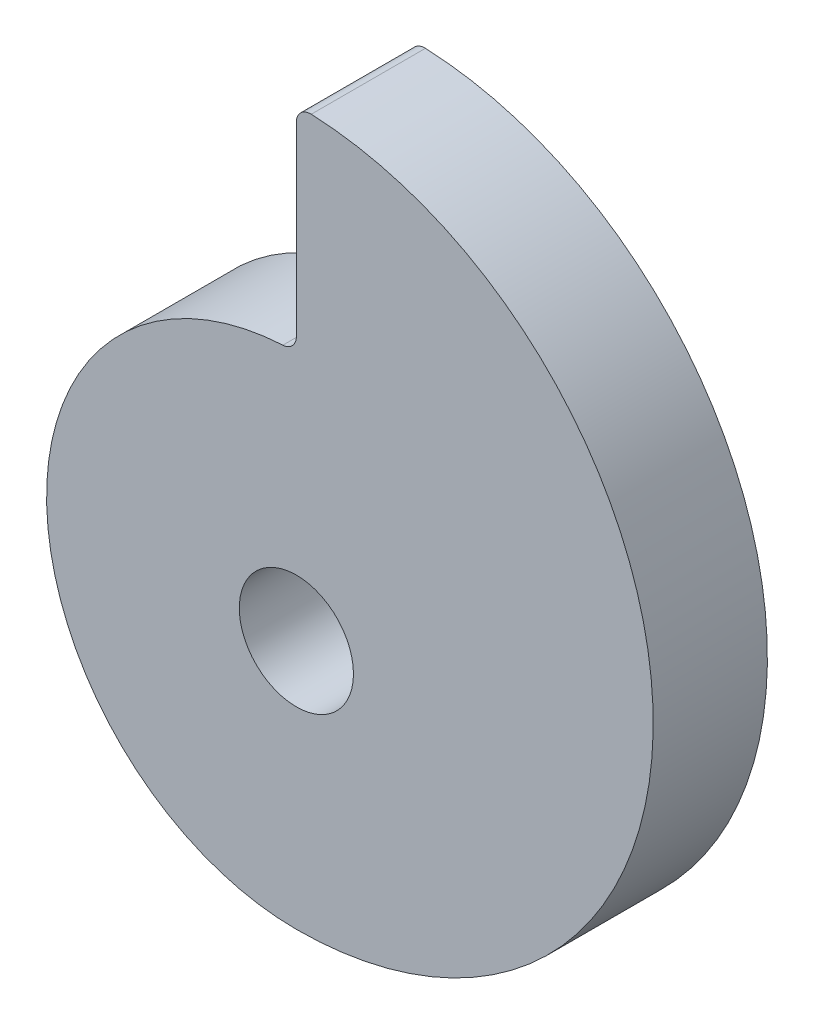
ISO-10303-21;
HEADER;
FILE_DESCRIPTION(('STEP AP214'),'2;1');
FILE_NAME('part.step','',(''),(''),'','','');
FILE_SCHEMA(('AUTOMOTIVE_DESIGN { 1 0 10303 214 1 1 1 1 }'));
ENDSEC;
DATA;
#1=APPLICATION_CONTEXT('core data for automotive mechanical design processes');
#2=APPLICATION_PROTOCOL_DEFINITION('international standard','automotive_design',2000,#1);
#3=PRODUCT_CONTEXT('',#1,'mechanical');
#4=PRODUCT('Part','Part','',(#3));
#5=PRODUCT_RELATED_PRODUCT_CATEGORY('part','',(#4));
#6=PRODUCT_DEFINITION_FORMATION('','',#4);
#7=PRODUCT_DEFINITION_CONTEXT('part definition',#1,'design');
#8=PRODUCT_DEFINITION('design','',#6,#7);
#9=PRODUCT_DEFINITION_SHAPE('','',#8);
#10=(LENGTH_UNIT() NAMED_UNIT(*) SI_UNIT(.MILLI.,.METRE.));
#11=(NAMED_UNIT(*) PLANE_ANGLE_UNIT() SI_UNIT($,.RADIAN.));
#12=(NAMED_UNIT(*) SI_UNIT($,.STERADIAN.) SOLID_ANGLE_UNIT());
#13=UNCERTAINTY_MEASURE_WITH_UNIT(LENGTH_MEASURE(1.E-05),#10,'distance_accuracy_value','');
#14=(GEOMETRIC_REPRESENTATION_CONTEXT(3) GLOBAL_UNCERTAINTY_ASSIGNED_CONTEXT((#13)) GLOBAL_UNIT_ASSIGNED_CONTEXT((#10,
#11,#12)) REPRESENTATION_CONTEXT('',''));
#15=CARTESIAN_POINT('',(0.,0.,0.));
#16=DIRECTION('',(0.,0.,1.));
#17=DIRECTION('',(1.,0.,0.));
#18=AXIS2_PLACEMENT_3D('',#15,#16,#17);
#19=CARTESIAN_POINT('',(0.,-7.5,8.));
#20=DIRECTION('',(0.,0.,1.));
#21=DIRECTION('',(1.,0.,0.));
#22=AXIS2_PLACEMENT_3D('',#19,#20,#21);
#23=PLANE('',#22);
#24=CARTESIAN_POINT('',(0.,0.,8.));
#25=DIRECTION('',(0.,0.,1.));
#26=DIRECTION('',(1.,0.,0.));
#27=AXIS2_PLACEMENT_3D('',#24,#25,#26);
#28=CIRCLE('',#27,25.);
#29=CARTESIAN_POINT('',(0.,-25.,8.));
#30=VERTEX_POINT('',#29);
#31=CARTESIAN_POINT('',(1.04166666666667,24.9782891839204,8.));
#32=VERTEX_POINT('',#31);
#33=EDGE_CURVE('E86',#30,#32,#28,.T.);
#34=ORIENTED_EDGE('',*,*,#33,.T.);
#35=CARTESIAN_POINT('',(1.,23.9791576165636,8.));
#36=DIRECTION('',(0.,0.,1.));
#37=DIRECTION('',(1.,0.,0.));
#38=AXIS2_PLACEMENT_3D('',#35,#36,#37);
#39=CIRCLE('',#38,1.);
#40=CARTESIAN_POINT('',(0.,23.9791576165636,8.));
#41=VERTEX_POINT('',#40);
#42=EDGE_CURVE('E116',#32,#41,#39,.T.);
#43=ORIENTED_EDGE('',*,*,#42,.T.);
#44=DIRECTION('',(0.,-1.,0.));
#45=VECTOR('',#44,1.);
#46=CARTESIAN_POINT('',(0.,10.,8.));
#47=LINE('',#46,#45);
#48=CARTESIAN_POINT('',(0.,10.9729532019112,8.));
#49=VERTEX_POINT('',#48);
#50=EDGE_CURVE('E97',#41,#49,#47,.T.);
#51=ORIENTED_EDGE('',*,*,#50,.T.);
#52=CARTESIAN_POINT('',(-1.,10.9729532019112,8.));
#53=DIRECTION('',(0.,0.,1.));
#54=DIRECTION('',(1.,0.,0.));
#55=AXIS2_PLACEMENT_3D('',#52,#53,#54);
#56=CIRCLE('',#55,1.);
#57=CARTESIAN_POINT('',(-0.945945945945946,9.97441519099705,8.));
#58=VERTEX_POINT('',#57);
#59=EDGE_CURVE('E11',#49,#58,#56,.F.);
#60=ORIENTED_EDGE('',*,*,#59,.T.);
#61=CARTESIAN_POINT('',(0.,-7.5,8.));
#62=DIRECTION('',(0.,0.,1.));
#63=DIRECTION('',(1.,0.,0.));
#64=AXIS2_PLACEMENT_3D('',#61,#62,#63);
#65=CIRCLE('',#64,17.5);
#66=EDGE_CURVE('E84',#58,#30,#65,.T.);
#67=ORIENTED_EDGE('',*,*,#66,.T.);
#68=EDGE_LOOP('',(#34,#43,#51,#60,#67));
#69=FACE_BOUND('',#68,.T.);
#70=CARTESIAN_POINT('',(0.,-7.5,8.));
#71=DIRECTION('',(0.,0.,1.));
#72=DIRECTION('',(1.,0.,0.));
#73=AXIS2_PLACEMENT_3D('',#70,#71,#72);
#74=CIRCLE('',#73,4.);
#75=CARTESIAN_POINT('',(3.99999999999999,-7.5,8.));
#76=VERTEX_POINT('',#75);
#77=EDGE_CURVE('E200',#76,#76,#74,.T.);
#78=ORIENTED_EDGE('',*,*,#77,.F.);
#79=EDGE_LOOP('',(#78));
#80=FACE_BOUND('',#79,.T.);
#81=ADVANCED_FACE('F39',(#69,#80),#23,.T.);
#82=CARTESIAN_POINT('',(0.,-7.5,0.));
#83=DIRECTION('',(0.,0.,1.));
#84=DIRECTION('',(1.,0.,0.));
#85=AXIS2_PLACEMENT_3D('',#82,#83,#84);
#86=PLANE('',#85);
#87=DIRECTION('',(0.,-1.,0.));
#88=VECTOR('',#87,1.);
#89=CARTESIAN_POINT('',(0.,10.,0.));
#90=LINE('',#89,#88);
#91=CARTESIAN_POINT('',(0.,23.9791576165636,0.));
#92=VERTEX_POINT('',#91);
#93=CARTESIAN_POINT('',(0.,10.9729532019112,0.));
#94=VERTEX_POINT('',#93);
#95=EDGE_CURVE('E92',#92,#94,#90,.T.);
#96=ORIENTED_EDGE('',*,*,#95,.F.);
#97=CARTESIAN_POINT('',(1.,23.9791576165636,0.));
#98=DIRECTION('',(0.,0.,1.));
#99=DIRECTION('',(1.,0.,0.));
#100=AXIS2_PLACEMENT_3D('',#97,#98,#99);
#101=CIRCLE('',#100,1.);
#102=CARTESIAN_POINT('',(1.04166666666667,24.9782891839204,0.));
#103=VERTEX_POINT('',#102);
#104=EDGE_CURVE('E113',#92,#103,#101,.F.);
#105=ORIENTED_EDGE('',*,*,#104,.T.);
#106=CARTESIAN_POINT('',(0.,0.,0.));
#107=DIRECTION('',(0.,0.,1.));
#108=DIRECTION('',(1.,0.,0.));
#109=AXIS2_PLACEMENT_3D('',#106,#107,#108);
#110=CIRCLE('',#109,25.);
#111=CARTESIAN_POINT('',(0.,-25.,0.));
#112=VERTEX_POINT('',#111);
#113=EDGE_CURVE('E130',#112,#103,#110,.T.);
#114=ORIENTED_EDGE('',*,*,#113,.F.);
#115=CARTESIAN_POINT('',(0.,-7.5,0.));
#116=DIRECTION('',(0.,0.,1.));
#117=DIRECTION('',(1.,0.,0.));
#118=AXIS2_PLACEMENT_3D('',#115,#116,#117);
#119=CIRCLE('',#118,17.5);
#120=CARTESIAN_POINT('',(-0.945945945945946,9.97441519099705,0.));
#121=VERTEX_POINT('',#120);
#122=EDGE_CURVE('E101',#121,#112,#119,.T.);
#123=ORIENTED_EDGE('',*,*,#122,.F.);
#124=CARTESIAN_POINT('',(-1.,10.9729532019112,0.));
#125=DIRECTION('',(0.,0.,1.));
#126=DIRECTION('',(1.,0.,0.));
#127=AXIS2_PLACEMENT_3D('',#124,#125,#126);
#128=CIRCLE('',#127,1.);
#129=EDGE_CURVE('E47',#121,#94,#128,.T.);
#130=ORIENTED_EDGE('',*,*,#129,.T.);
#131=EDGE_LOOP('',(#96,#105,#114,#123,#130));
#132=FACE_BOUND('',#131,.T.);
#133=CARTESIAN_POINT('',(0.,-7.5,0.));
#134=DIRECTION('',(0.,0.,1.));
#135=DIRECTION('',(1.,0.,0.));
#136=AXIS2_PLACEMENT_3D('',#133,#134,#135);
#137=CIRCLE('',#136,4.);
#138=CARTESIAN_POINT('',(3.99999999999999,-7.5,0.));
#139=VERTEX_POINT('',#138);
#140=EDGE_CURVE('E203',#139,#139,#137,.T.);
#141=ORIENTED_EDGE('',*,*,#140,.T.);
#142=EDGE_LOOP('',(#141));
#143=FACE_BOUND('',#142,.T.);
#144=ADVANCED_FACE('F122',(#132,#143),#86,.F.);
#145=CARTESIAN_POINT('',(0.,-7.5,8.));
#146=DIRECTION('',(0.,0.,-1.));
#147=DIRECTION('',(-1.,0.,0.));
#148=AXIS2_PLACEMENT_3D('',#145,#146,#147);
#149=CYLINDRICAL_SURFACE('',#148,17.5);
#150=ORIENTED_EDGE('',*,*,#66,.F.);
#151=DIRECTION('',(0.,0.,-1.));
#152=VECTOR('',#151,1.);
#153=CARTESIAN_POINT('',(-0.945945945945946,9.97441519099705,8.));
#154=LINE('',#153,#152);
#155=EDGE_CURVE('E118',#58,#121,#154,.T.);
#156=ORIENTED_EDGE('',*,*,#155,.T.);
#157=ORIENTED_EDGE('',*,*,#122,.T.);
#158=DIRECTION('',(0.,0.,-1.));
#159=VECTOR('',#158,1.);
#160=CARTESIAN_POINT('',(0.,-25.,8.));
#161=LINE('',#160,#159);
#162=EDGE_CURVE('E96',#30,#112,#161,.T.);
#163=ORIENTED_EDGE('',*,*,#162,.F.);
#164=EDGE_LOOP('',(#150,#156,#157,#163));
#165=FACE_BOUND('',#164,.T.);
#166=ADVANCED_FACE('F99',(#165),#149,.T.);
#167=CARTESIAN_POINT('',(0.,0.,8.));
#168=DIRECTION('',(0.,0.,-1.));
#169=DIRECTION('',(-1.,0.,0.));
#170=AXIS2_PLACEMENT_3D('',#167,#168,#169);
#171=CYLINDRICAL_SURFACE('',#170,25.);
#172=ORIENTED_EDGE('',*,*,#113,.T.);
#173=DIRECTION('',(0.,0.,-1.));
#174=VECTOR('',#173,1.);
#175=CARTESIAN_POINT('',(1.04166666666667,24.9782891839204,8.));
#176=LINE('',#175,#174);
#177=EDGE_CURVE('E60',#103,#32,#176,.F.);
#178=ORIENTED_EDGE('',*,*,#177,.T.);
#179=ORIENTED_EDGE('',*,*,#33,.F.);
#180=ORIENTED_EDGE('',*,*,#162,.T.);
#181=EDGE_LOOP('',(#172,#178,#179,#180));
#182=FACE_BOUND('',#181,.T.);
#183=ADVANCED_FACE('F95',(#182),#171,.T.);
#184=CARTESIAN_POINT('',(0.,10.,8.));
#185=DIRECTION('',(1.,0.,0.));
#186=DIRECTION('',(0.,0.,-1.));
#187=AXIS2_PLACEMENT_3D('',#184,#185,#186);
#188=PLANE('',#187);
#189=ORIENTED_EDGE('',*,*,#50,.F.);
#190=DIRECTION('',(0.,0.,-1.));
#191=VECTOR('',#190,1.);
#192=CARTESIAN_POINT('',(0.,23.9791576165636,8.));
#193=LINE('',#192,#191);
#194=EDGE_CURVE('E105',#41,#92,#193,.T.);
#195=ORIENTED_EDGE('',*,*,#194,.T.);
#196=ORIENTED_EDGE('',*,*,#95,.T.);
#197=DIRECTION('',(0.,0.,1.));
#198=VECTOR('',#197,1.);
#199=CARTESIAN_POINT('',(0.,10.9729532019112,8.));
#200=LINE('',#199,#198);
#201=EDGE_CURVE('E103',#94,#49,#200,.T.);
#202=ORIENTED_EDGE('',*,*,#201,.T.);
#203=EDGE_LOOP('',(#189,#195,#196,#202));
#204=FACE_BOUND('',#203,.T.);
#205=ADVANCED_FACE('F128',(#204),#188,.F.);
#206=CARTESIAN_POINT('',(0.,-7.5,8.));
#207=DIRECTION('',(0.,0.,-1.));
#208=DIRECTION('',(-1.,0.,0.));
#209=AXIS2_PLACEMENT_3D('',#206,#207,#208);
#210=CYLINDRICAL_SURFACE('',#209,4.);
#211=ORIENTED_EDGE('',*,*,#77,.T.);
#212=EDGE_LOOP('',(#211));
#213=FACE_BOUND('',#212,.T.);
#214=ORIENTED_EDGE('',*,*,#140,.F.);
#215=EDGE_LOOP('',(#214));
#216=FACE_BOUND('',#215,.T.);
#217=ADVANCED_FACE('F136',(#213,#216),#210,.F.);
#218=CARTESIAN_POINT('',(1.,23.9791576165636,8.));
#219=DIRECTION('',(0.,0.,-1.));
#220=DIRECTION('',(-1.,0.,0.));
#221=AXIS2_PLACEMENT_3D('',#218,#219,#220);
#222=CYLINDRICAL_SURFACE('',#221,1.);
#223=ORIENTED_EDGE('',*,*,#42,.F.);
#224=ORIENTED_EDGE('',*,*,#177,.F.);
#225=ORIENTED_EDGE('',*,*,#104,.F.);
#226=ORIENTED_EDGE('',*,*,#194,.F.);
#227=EDGE_LOOP('',(#223,#224,#225,#226));
#228=FACE_BOUND('',#227,.T.);
#229=ADVANCED_FACE('F132',(#228),#222,.T.);
#230=CARTESIAN_POINT('',(-1.,10.9729532019112,8.));
#231=DIRECTION('',(0.,0.,-1.));
#232=DIRECTION('',(-1.,0.,0.));
#233=AXIS2_PLACEMENT_3D('',#230,#231,#232);
#234=CYLINDRICAL_SURFACE('',#233,1.);
#235=ORIENTED_EDGE('',*,*,#59,.F.);
#236=ORIENTED_EDGE('',*,*,#201,.F.);
#237=ORIENTED_EDGE('',*,*,#129,.F.);
#238=ORIENTED_EDGE('',*,*,#155,.F.);
#239=EDGE_LOOP('',(#235,#236,#237,#238));
#240=FACE_BOUND('',#239,.T.);
#241=ADVANCED_FACE('F41',(#240),#234,.F.);
#242=CLOSED_SHELL('',(#81,#144,#166,#183,#205,#217,#229,#241));
#243=MANIFOLD_SOLID_BREP('B2',#242);
#244=ADVANCED_BREP_SHAPE_REPRESENTATION('',(#18,#243),#14);
#245=SHAPE_DEFINITION_REPRESENTATION(#9,#244);
ENDSEC;
END-ISO-10303-21;
